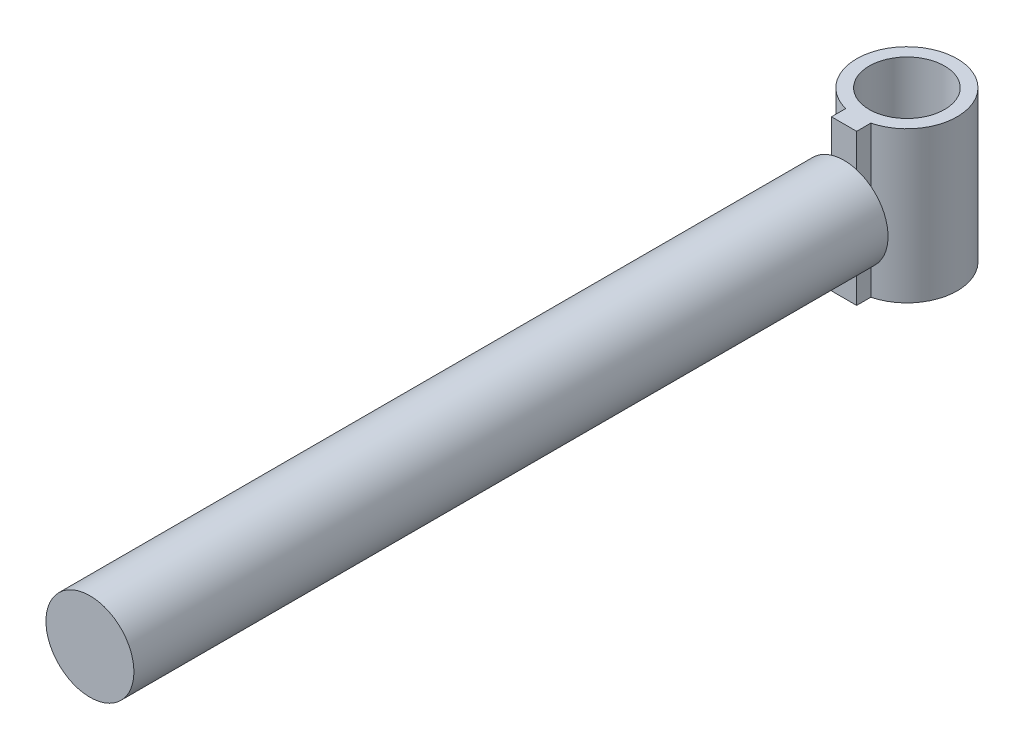
ISO-10303-21;
HEADER;
FILE_DESCRIPTION(('STEP AP214'),'2;1');
FILE_NAME('part.step','',(''),(''),'','','');
FILE_SCHEMA(('AUTOMOTIVE_DESIGN { 1 0 10303 214 1 1 1 1 }'));
ENDSEC;
DATA;
#1=APPLICATION_CONTEXT('core data for automotive mechanical design processes');
#2=APPLICATION_PROTOCOL_DEFINITION('international standard','automotive_design',2000,#1);
#3=PRODUCT_CONTEXT('',#1,'mechanical');
#4=PRODUCT('Part','Part','',(#3));
#5=PRODUCT_RELATED_PRODUCT_CATEGORY('part','',(#4));
#6=PRODUCT_DEFINITION_FORMATION('','',#4);
#7=PRODUCT_DEFINITION_CONTEXT('part definition',#1,'design');
#8=PRODUCT_DEFINITION('design','',#6,#7);
#9=PRODUCT_DEFINITION_SHAPE('','',#8);
#10=(LENGTH_UNIT() NAMED_UNIT(*) SI_UNIT(.MILLI.,.METRE.));
#11=(NAMED_UNIT(*) PLANE_ANGLE_UNIT() SI_UNIT($,.RADIAN.));
#12=(NAMED_UNIT(*) SI_UNIT($,.STERADIAN.) SOLID_ANGLE_UNIT());
#13=UNCERTAINTY_MEASURE_WITH_UNIT(LENGTH_MEASURE(1.E-05),#10,'distance_accuracy_value','');
#14=(GEOMETRIC_REPRESENTATION_CONTEXT(3) GLOBAL_UNCERTAINTY_ASSIGNED_CONTEXT((#13)) GLOBAL_UNIT_ASSIGNED_CONTEXT((#10,
#11,#12)) REPRESENTATION_CONTEXT('',''));
#15=CARTESIAN_POINT('',(0.,0.,0.));
#16=DIRECTION('',(0.,0.,1.));
#17=DIRECTION('',(1.,0.,0.));
#18=AXIS2_PLACEMENT_3D('',#15,#16,#17);
#19=CARTESIAN_POINT('',(0.,0.,0.));
#20=DIRECTION('',(0.,0.,1.));
#21=DIRECTION('',(1.,0.,0.));
#22=AXIS2_PLACEMENT_3D('',#19,#20,#21);
#23=PLANE('',#22);
#24=DIRECTION('',(0.,-1.,0.));
#25=VECTOR('',#24,1.);
#26=CARTESIAN_POINT('',(10.,60.,0.));
#27=LINE('',#26,#25);
#28=CARTESIAN_POINT('',(10.,33.5410196624969,0.));
#29=VERTEX_POINT('',#28);
#30=CARTESIAN_POINT('',(10.,-33.5410196624969,0.));
#31=VERTEX_POINT('',#30);
#32=EDGE_CURVE('E11',#29,#31,#27,.T.);
#33=ORIENTED_EDGE('',*,*,#32,.F.);
#34=CARTESIAN_POINT('',(0.,0.,0.));
#35=DIRECTION('',(0.,0.,1.));
#36=DIRECTION('',(1.,0.,0.));
#37=AXIS2_PLACEMENT_3D('',#34,#35,#36);
#38=CIRCLE('',#37,35.);
#39=EDGE_CURVE('E110',#31,#29,#38,.T.);
#40=ORIENTED_EDGE('',*,*,#39,.F.);
#41=EDGE_LOOP('',(#33,#40));
#42=FACE_BOUND('',#41,.T.);
#43=ADVANCED_FACE('F32',(#42),#23,.F.);
#44=CARTESIAN_POINT('',(0.,0.,600.));
#45=DIRECTION('',(0.,0.,-1.));
#46=DIRECTION('',(-1.,0.,0.));
#47=AXIS2_PLACEMENT_3D('',#44,#45,#46);
#48=CYLINDRICAL_SURFACE('',#47,35.);
#49=CARTESIAN_POINT('',(0.,0.,600.));
#50=DIRECTION('',(0.,0.,1.));
#51=DIRECTION('',(1.,0.,0.));
#52=AXIS2_PLACEMENT_3D('',#49,#50,#51);
#53=CIRCLE('',#52,35.);
#54=CARTESIAN_POINT('',(35.,0.,600.));
#55=VERTEX_POINT('',#54);
#56=EDGE_CURVE('E115',#55,#55,#53,.T.);
#57=ORIENTED_EDGE('',*,*,#56,.F.);
#58=EDGE_LOOP('',(#57));
#59=FACE_BOUND('',#58,.T.);
#60=CARTESIAN_POINT('',(-10.,33.5410196624969,0.));
#61=VERTEX_POINT('',#60);
#62=EDGE_CURVE('E36',#29,#61,#38,.T.);
#63=ORIENTED_EDGE('',*,*,#62,.T.);
#64=CARTESIAN_POINT('',(-10.,-33.5410196624969,0.));
#65=VERTEX_POINT('',#64);
#66=EDGE_CURVE('E121',#61,#65,#38,.T.);
#67=ORIENTED_EDGE('',*,*,#66,.T.);
#68=EDGE_CURVE('E112',#65,#31,#38,.T.);
#69=ORIENTED_EDGE('',*,*,#68,.T.);
#70=ORIENTED_EDGE('',*,*,#39,.T.);
#71=EDGE_LOOP('',(#63,#67,#69,#70));
#72=FACE_BOUND('',#71,.T.);
#73=ADVANCED_FACE('F34',(#59,#72),#48,.T.);
#74=CARTESIAN_POINT('',(0.,0.,600.));
#75=DIRECTION('',(0.,0.,1.));
#76=DIRECTION('',(1.,0.,0.));
#77=AXIS2_PLACEMENT_3D('',#74,#75,#76);
#78=PLANE('',#77);
#79=ORIENTED_EDGE('',*,*,#56,.T.);
#80=EDGE_LOOP('',(#79));
#81=FACE_BOUND('',#80,.T.);
#82=ADVANCED_FACE('F133',(#81),#78,.T.);
#83=ORIENTED_EDGE('',*,*,#66,.F.);
#84=DIRECTION('',(0.,-1.,0.));
#85=VECTOR('',#84,1.);
#86=CARTESIAN_POINT('',(-10.,60.,0.));
#87=LINE('',#86,#85);
#88=EDGE_CURVE('E41',#61,#65,#87,.T.);
#89=ORIENTED_EDGE('',*,*,#88,.T.);
#90=EDGE_LOOP('',(#83,#89));
#91=FACE_BOUND('',#90,.T.);
#92=ADVANCED_FACE('F131',(#91),#23,.F.);
#93=CARTESIAN_POINT('',(-10.,60.,0.));
#94=DIRECTION('',(0.,0.,-1.));
#95=DIRECTION('',(-1.,0.,0.));
#96=AXIS2_PLACEMENT_3D('',#93,#94,#95);
#97=PLANE('',#96);
#98=ORIENTED_EDGE('',*,*,#62,.F.);
#99=CARTESIAN_POINT('',(10.,60.,0.));
#100=VERTEX_POINT('',#99);
#101=EDGE_CURVE('E43',#100,#29,#27,.T.);
#102=ORIENTED_EDGE('',*,*,#101,.F.);
#103=DIRECTION('',(1.,0.,0.));
#104=VECTOR('',#103,1.);
#105=CARTESIAN_POINT('',(-10.,60.,0.));
#106=LINE('',#105,#104);
#107=CARTESIAN_POINT('',(-10.,60.,0.));
#108=VERTEX_POINT('',#107);
#109=EDGE_CURVE('E98',#108,#100,#106,.T.);
#110=ORIENTED_EDGE('',*,*,#109,.F.);
#111=EDGE_CURVE('E120',#108,#61,#87,.T.);
#112=ORIENTED_EDGE('',*,*,#111,.T.);
#113=EDGE_LOOP('',(#98,#102,#110,#112));
#114=FACE_BOUND('',#113,.T.);
#115=ADVANCED_FACE('F108',(#114),#97,.F.);
#116=CARTESIAN_POINT('',(0.,60.,-50.));
#117=DIRECTION('',(0.,1.,0.));
#118=DIRECTION('',(0.,0.,1.));
#119=AXIS2_PLACEMENT_3D('',#116,#117,#118);
#120=PLANE('',#119);
#121=ORIENTED_EDGE('',*,*,#109,.T.);
#122=DIRECTION('',(0.,0.,-1.));
#123=VECTOR('',#122,1.);
#124=CARTESIAN_POINT('',(10.,60.,0.));
#125=LINE('',#124,#123);
#126=CARTESIAN_POINT('',(10.,60.,-11.2701665379258));
#127=VERTEX_POINT('',#126);
#128=EDGE_CURVE('E88',#100,#127,#125,.T.);
#129=ORIENTED_EDGE('',*,*,#128,.T.);
#130=CARTESIAN_POINT('',(0.,60.,-50.));
#131=DIRECTION('',(0.,1.,0.));
#132=DIRECTION('',(0.,0.,1.));
#133=AXIS2_PLACEMENT_3D('',#130,#131,#132);
#134=CIRCLE('',#133,40.);
#135=CARTESIAN_POINT('',(-10.,60.,-11.2701665379258));
#136=VERTEX_POINT('',#135);
#137=EDGE_CURVE('E97',#127,#136,#134,.T.);
#138=ORIENTED_EDGE('',*,*,#137,.T.);
#139=DIRECTION('',(0.,0.,1.));
#140=VECTOR('',#139,1.);
#141=CARTESIAN_POINT('',(-10.,60.,0.));
#142=LINE('',#141,#140);
#143=EDGE_CURVE('E104',#136,#108,#142,.T.);
#144=ORIENTED_EDGE('',*,*,#143,.T.);
#145=EDGE_LOOP('',(#121,#129,#138,#144));
#146=FACE_BOUND('',#145,.T.);
#147=CARTESIAN_POINT('',(0.,60.,-50.));
#148=DIRECTION('',(0.,1.,0.));
#149=DIRECTION('',(0.,0.,1.));
#150=AXIS2_PLACEMENT_3D('',#147,#148,#149);
#151=CIRCLE('',#150,30.);
#152=CARTESIAN_POINT('',(0.,60.,-20.));
#153=VERTEX_POINT('',#152);
#154=EDGE_CURVE('E157',#153,#153,#151,.T.);
#155=ORIENTED_EDGE('',*,*,#154,.F.);
#156=EDGE_LOOP('',(#155));
#157=FACE_BOUND('',#156,.T.);
#158=ADVANCED_FACE('F101',(#146,#157),#120,.T.);
#159=CARTESIAN_POINT('',(0.,-60.,-50.));
#160=DIRECTION('',(0.,1.,0.));
#161=DIRECTION('',(0.,0.,1.));
#162=AXIS2_PLACEMENT_3D('',#159,#160,#161);
#163=PLANE('',#162);
#164=DIRECTION('',(1.,0.,0.));
#165=VECTOR('',#164,1.);
#166=CARTESIAN_POINT('',(-10.,-60.,0.));
#167=LINE('',#166,#165);
#168=CARTESIAN_POINT('',(-10.,-60.,0.));
#169=VERTEX_POINT('',#168);
#170=CARTESIAN_POINT('',(10.,-60.,0.));
#171=VERTEX_POINT('',#170);
#172=EDGE_CURVE('E154',#169,#171,#167,.T.);
#173=ORIENTED_EDGE('',*,*,#172,.F.);
#174=DIRECTION('',(0.,0.,1.));
#175=VECTOR('',#174,1.);
#176=CARTESIAN_POINT('',(-10.,-60.,0.));
#177=LINE('',#176,#175);
#178=CARTESIAN_POINT('',(-10.,-60.,-11.2701665379258));
#179=VERTEX_POINT('',#178);
#180=EDGE_CURVE('E106',#179,#169,#177,.T.);
#181=ORIENTED_EDGE('',*,*,#180,.F.);
#182=CARTESIAN_POINT('',(0.,-60.,-50.));
#183=DIRECTION('',(0.,1.,0.));
#184=DIRECTION('',(0.,0.,1.));
#185=AXIS2_PLACEMENT_3D('',#182,#183,#184);
#186=CIRCLE('',#185,40.);
#187=CARTESIAN_POINT('',(10.,-60.,-11.2701665379258));
#188=VERTEX_POINT('',#187);
#189=EDGE_CURVE('E155',#188,#179,#186,.T.);
#190=ORIENTED_EDGE('',*,*,#189,.F.);
#191=DIRECTION('',(0.,0.,-1.));
#192=VECTOR('',#191,1.);
#193=CARTESIAN_POINT('',(10.,-60.,0.));
#194=LINE('',#193,#192);
#195=EDGE_CURVE('E147',#171,#188,#194,.T.);
#196=ORIENTED_EDGE('',*,*,#195,.F.);
#197=EDGE_LOOP('',(#173,#181,#190,#196));
#198=FACE_BOUND('',#197,.T.);
#199=CARTESIAN_POINT('',(0.,-60.,-50.));
#200=DIRECTION('',(0.,1.,0.));
#201=DIRECTION('',(0.,0.,1.));
#202=AXIS2_PLACEMENT_3D('',#199,#200,#201);
#203=CIRCLE('',#202,30.);
#204=CARTESIAN_POINT('',(0.,-60.,-20.));
#205=VERTEX_POINT('',#204);
#206=EDGE_CURVE('E160',#205,#205,#203,.T.);
#207=ORIENTED_EDGE('',*,*,#206,.T.);
#208=EDGE_LOOP('',(#207));
#209=FACE_BOUND('',#208,.T.);
#210=ADVANCED_FACE('F151',(#198,#209),#163,.F.);
#211=ORIENTED_EDGE('',*,*,#68,.F.);
#212=EDGE_CURVE('E51',#65,#169,#87,.T.);
#213=ORIENTED_EDGE('',*,*,#212,.T.);
#214=ORIENTED_EDGE('',*,*,#172,.T.);
#215=EDGE_CURVE('E44',#31,#171,#27,.T.);
#216=ORIENTED_EDGE('',*,*,#215,.F.);
#217=EDGE_LOOP('',(#211,#213,#214,#216));
#218=FACE_BOUND('',#217,.T.);
#219=ADVANCED_FACE('F128',(#218),#97,.F.);
#220=CARTESIAN_POINT('',(10.,60.,0.));
#221=DIRECTION('',(-1.,0.,0.));
#222=DIRECTION('',(0.,0.,1.));
#223=AXIS2_PLACEMENT_3D('',#220,#221,#222);
#224=PLANE('',#223);
#225=ORIENTED_EDGE('',*,*,#195,.T.);
#226=DIRECTION('',(0.,-1.,0.));
#227=VECTOR('',#226,1.);
#228=CARTESIAN_POINT('',(10.,60.,-11.2701665379258));
#229=LINE('',#228,#227);
#230=EDGE_CURVE('E94',#127,#188,#229,.T.);
#231=ORIENTED_EDGE('',*,*,#230,.F.);
#232=ORIENTED_EDGE('',*,*,#128,.F.);
#233=ORIENTED_EDGE('',*,*,#101,.T.);
#234=ORIENTED_EDGE('',*,*,#32,.T.);
#235=ORIENTED_EDGE('',*,*,#215,.T.);
#236=EDGE_LOOP('',(#225,#231,#232,#233,#234,#235));
#237=FACE_BOUND('',#236,.T.);
#238=ADVANCED_FACE('F90',(#237),#224,.F.);
#239=CARTESIAN_POINT('',(0.,60.,-50.));
#240=DIRECTION('',(0.,-1.,0.));
#241=DIRECTION('',(0.,0.,-1.));
#242=AXIS2_PLACEMENT_3D('',#239,#240,#241);
#243=CYLINDRICAL_SURFACE('',#242,40.);
#244=ORIENTED_EDGE('',*,*,#189,.T.);
#245=DIRECTION('',(0.,-1.,0.));
#246=VECTOR('',#245,1.);
#247=CARTESIAN_POINT('',(-10.,60.,-11.2701665379258));
#248=LINE('',#247,#246);
#249=EDGE_CURVE('E166',#136,#179,#248,.T.);
#250=ORIENTED_EDGE('',*,*,#249,.F.);
#251=ORIENTED_EDGE('',*,*,#137,.F.);
#252=ORIENTED_EDGE('',*,*,#230,.T.);
#253=EDGE_LOOP('',(#244,#250,#251,#252));
#254=FACE_BOUND('',#253,.T.);
#255=ADVANCED_FACE('F170',(#254),#243,.T.);
#256=CARTESIAN_POINT('',(-10.,60.,0.));
#257=DIRECTION('',(1.,0.,0.));
#258=DIRECTION('',(0.,0.,-1.));
#259=AXIS2_PLACEMENT_3D('',#256,#257,#258);
#260=PLANE('',#259);
#261=ORIENTED_EDGE('',*,*,#180,.T.);
#262=ORIENTED_EDGE('',*,*,#212,.F.);
#263=ORIENTED_EDGE('',*,*,#88,.F.);
#264=ORIENTED_EDGE('',*,*,#111,.F.);
#265=ORIENTED_EDGE('',*,*,#143,.F.);
#266=ORIENTED_EDGE('',*,*,#249,.T.);
#267=EDGE_LOOP('',(#261,#262,#263,#264,#265,#266));
#268=FACE_BOUND('',#267,.T.);
#269=ADVANCED_FACE('F177',(#268),#260,.F.);
#270=CARTESIAN_POINT('',(0.,60.,-50.));
#271=DIRECTION('',(0.,-1.,0.));
#272=DIRECTION('',(0.,0.,-1.));
#273=AXIS2_PLACEMENT_3D('',#270,#271,#272);
#274=CYLINDRICAL_SURFACE('',#273,30.);
#275=ORIENTED_EDGE('',*,*,#154,.T.);
#276=EDGE_LOOP('',(#275));
#277=FACE_BOUND('',#276,.T.);
#278=ORIENTED_EDGE('',*,*,#206,.F.);
#279=EDGE_LOOP('',(#278));
#280=FACE_BOUND('',#279,.T.);
#281=ADVANCED_FACE('F175',(#277,#280),#274,.F.);
#282=CLOSED_SHELL('',(#43,#73,#82,#92,#115,#158,#210,#219,#238,#255,#269,#281));
#283=MANIFOLD_SOLID_BREP('B2',#282);
#284=ADVANCED_BREP_SHAPE_REPRESENTATION('',(#18,#283),#14);
#285=SHAPE_DEFINITION_REPRESENTATION(#9,#284);
ENDSEC;
END-ISO-10303-21;
